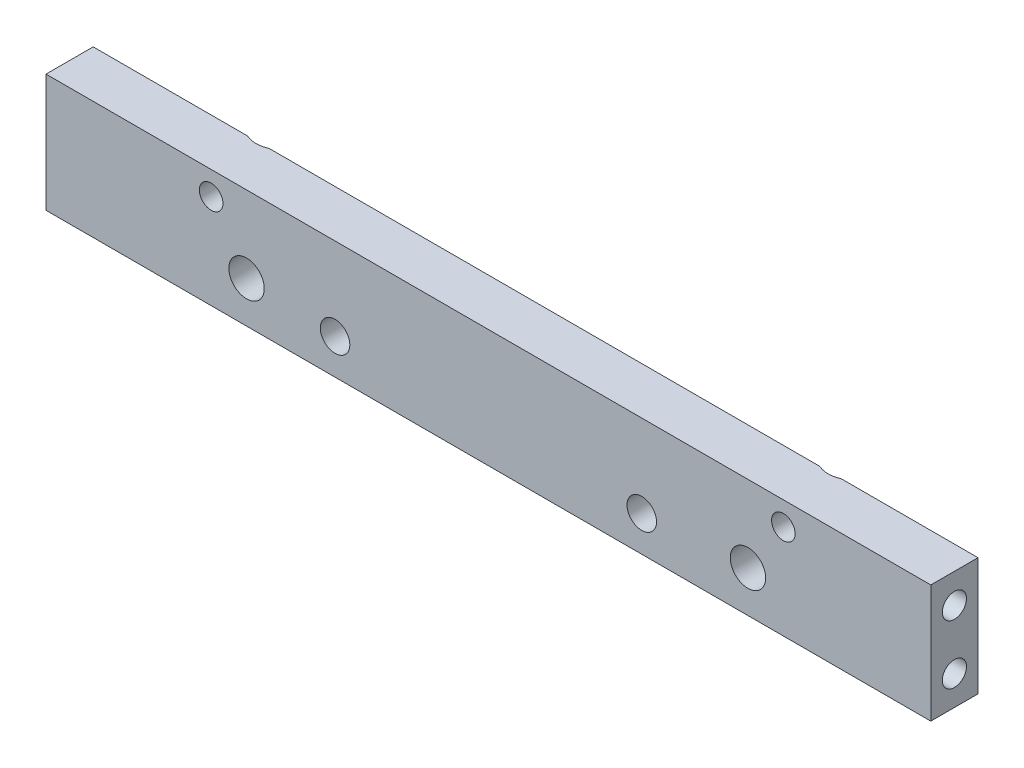
ISO-10303-21;
HEADER;
FILE_DESCRIPTION(('STEP AP214'),'2;1');
FILE_NAME('part.step','',(''),(''),'','','');
FILE_SCHEMA(('AUTOMOTIVE_DESIGN { 1 0 10303 214 1 1 1 1 }'));
ENDSEC;
DATA;
#1=APPLICATION_CONTEXT('core data for automotive mechanical design processes');
#2=APPLICATION_PROTOCOL_DEFINITION('international standard','automotive_design',2000,#1);
#3=PRODUCT_CONTEXT('',#1,'mechanical');
#4=PRODUCT('Part','Part','',(#3));
#5=PRODUCT_RELATED_PRODUCT_CATEGORY('part','',(#4));
#6=PRODUCT_DEFINITION_FORMATION('','',#4);
#7=PRODUCT_DEFINITION_CONTEXT('part definition',#1,'design');
#8=PRODUCT_DEFINITION('design','',#6,#7);
#9=PRODUCT_DEFINITION_SHAPE('','',#8);
#10=(LENGTH_UNIT() NAMED_UNIT(*) SI_UNIT(.MILLI.,.METRE.));
#11=(NAMED_UNIT(*) PLANE_ANGLE_UNIT() SI_UNIT($,.RADIAN.));
#12=(NAMED_UNIT(*) SI_UNIT($,.STERADIAN.) SOLID_ANGLE_UNIT());
#13=UNCERTAINTY_MEASURE_WITH_UNIT(LENGTH_MEASURE(1.E-05),#10,'distance_accuracy_value','');
#14=(GEOMETRIC_REPRESENTATION_CONTEXT(3) GLOBAL_UNCERTAINTY_ASSIGNED_CONTEXT((#13)) GLOBAL_UNIT_ASSIGNED_CONTEXT((#10,
#11,#12)) REPRESENTATION_CONTEXT('',''));
#15=CARTESIAN_POINT('',(0.,0.,0.));
#16=DIRECTION('',(0.,0.,1.));
#17=DIRECTION('',(1.,0.,0.));
#18=AXIS2_PLACEMENT_3D('',#15,#16,#17);
#19=CARTESIAN_POINT('',(0.,0.,0.));
#20=DIRECTION('',(0.,0.,1.));
#21=DIRECTION('',(1.,0.,0.));
#22=AXIS2_PLACEMENT_3D('',#19,#20,#21);
#23=PLANE('',#22);
#24=CARTESIAN_POINT('',(-13.,-2.,0.));
#25=DIRECTION('',(0.,0.,-1.));
#26=DIRECTION('',(-1.,0.,0.));
#27=AXIS2_PLACEMENT_3D('',#24,#25,#26);
#28=CIRCLE('',#27,1.24999999999999);
#29=CARTESIAN_POINT('',(-14.25,-2.,0.));
#30=VERTEX_POINT('',#29);
#31=EDGE_CURVE('E175',#30,#30,#28,.T.);
#32=ORIENTED_EDGE('',*,*,#31,.F.);
#33=EDGE_LOOP('',(#32));
#34=FACE_BOUND('',#33,.T.);
#35=CARTESIAN_POINT('',(13.,-2.,0.));
#36=DIRECTION('',(0.,0.,-1.));
#37=DIRECTION('',(-1.,0.,0.));
#38=AXIS2_PLACEMENT_3D('',#35,#36,#37);
#39=CIRCLE('',#38,1.24999999999999);
#40=CARTESIAN_POINT('',(11.75,-2.,0.));
#41=VERTEX_POINT('',#40);
#42=EDGE_CURVE('E169',#41,#41,#39,.T.);
#43=ORIENTED_EDGE('',*,*,#42,.F.);
#44=EDGE_LOOP('',(#43));
#45=FACE_BOUND('',#44,.T.);
#46=CARTESIAN_POINT('',(-20.5,-1.5,0.));
#47=DIRECTION('',(0.,0.,-1.));
#48=DIRECTION('',(-1.,0.,0.));
#49=AXIS2_PLACEMENT_3D('',#46,#47,#48);
#50=CIRCLE('',#49,2.8);
#51=CARTESIAN_POINT('',(-23.3,-1.5,0.));
#52=VERTEX_POINT('',#51);
#53=EDGE_CURVE('E160',#52,#52,#50,.T.);
#54=ORIENTED_EDGE('',*,*,#53,.F.);
#55=EDGE_LOOP('',(#54));
#56=FACE_BOUND('',#55,.T.);
#57=CARTESIAN_POINT('',(22.,-1.5,0.));
#58=DIRECTION('',(0.,0.,-1.));
#59=DIRECTION('',(-1.,0.,0.));
#60=AXIS2_PLACEMENT_3D('',#57,#58,#59);
#61=CIRCLE('',#60,2.8);
#62=CARTESIAN_POINT('',(19.2,-1.5,0.));
#63=VERTEX_POINT('',#62);
#64=EDGE_CURVE('E151',#63,#63,#61,.T.);
#65=ORIENTED_EDGE('',*,*,#64,.F.);
#66=EDGE_LOOP('',(#65));
#67=FACE_BOUND('',#66,.T.);
#68=CARTESIAN_POINT('',(-23.5,3.,0.));
#69=DIRECTION('',(0.,0.,-1.));
#70=DIRECTION('',(-1.,0.,0.));
#71=AXIS2_PLACEMENT_3D('',#68,#69,#70);
#72=CIRCLE('',#71,2.2);
#73=CARTESIAN_POINT('',(-22.5834848610088,5.,0.));
#74=VERTEX_POINT('',#73);
#75=CARTESIAN_POINT('',(-24.4165151389912,5.,0.));
#76=VERTEX_POINT('',#75);
#77=EDGE_CURVE('E55',#74,#76,#72,.T.);
#78=ORIENTED_EDGE('',*,*,#77,.F.);
#79=DIRECTION('',(-1.,0.,0.));
#80=VECTOR('',#79,1.);
#81=CARTESIAN_POINT('',(37.5,5.,0.));
#82=LINE('',#81,#80);
#83=CARTESIAN_POINT('',(24.0834848610088,5.,0.));
#84=VERTEX_POINT('',#83);
#85=EDGE_CURVE('E194',#84,#74,#82,.T.);
#86=ORIENTED_EDGE('',*,*,#85,.F.);
#87=CARTESIAN_POINT('',(25.,3.,0.));
#88=DIRECTION('',(0.,0.,-1.));
#89=DIRECTION('',(-1.,0.,0.));
#90=AXIS2_PLACEMENT_3D('',#87,#88,#89);
#91=CIRCLE('',#90,2.2);
#92=CARTESIAN_POINT('',(25.9165151389912,5.,0.));
#93=VERTEX_POINT('',#92);
#94=EDGE_CURVE('E62',#93,#84,#91,.T.);
#95=ORIENTED_EDGE('',*,*,#94,.F.);
#96=CARTESIAN_POINT('',(37.5,5.,0.));
#97=VERTEX_POINT('',#96);
#98=EDGE_CURVE('E190',#97,#93,#82,.T.);
#99=ORIENTED_EDGE('',*,*,#98,.F.);
#100=DIRECTION('',(0.,1.,0.));
#101=VECTOR('',#100,1.);
#102=CARTESIAN_POINT('',(37.5,-5.,0.));
#103=LINE('',#102,#101);
#104=CARTESIAN_POINT('',(37.5,-5.,0.));
#105=VERTEX_POINT('',#104);
#106=EDGE_CURVE('E185',#105,#97,#103,.T.);
#107=ORIENTED_EDGE('',*,*,#106,.F.);
#108=DIRECTION('',(1.,0.,0.));
#109=VECTOR('',#108,1.);
#110=CARTESIAN_POINT('',(-37.5,-5.,0.));
#111=LINE('',#110,#109);
#112=CARTESIAN_POINT('',(-37.5,-5.,0.));
#113=VERTEX_POINT('',#112);
#114=EDGE_CURVE('E182',#113,#105,#111,.T.);
#115=ORIENTED_EDGE('',*,*,#114,.F.);
#116=DIRECTION('',(0.,-1.,0.));
#117=VECTOR('',#116,1.);
#118=CARTESIAN_POINT('',(-37.5,5.,0.));
#119=LINE('',#118,#117);
#120=CARTESIAN_POINT('',(-37.5,5.,0.));
#121=VERTEX_POINT('',#120);
#122=EDGE_CURVE('E193',#121,#113,#119,.T.);
#123=ORIENTED_EDGE('',*,*,#122,.F.);
#124=EDGE_CURVE('E189',#76,#121,#82,.T.);
#125=ORIENTED_EDGE('',*,*,#124,.F.);
#126=EDGE_LOOP('',(#78,#86,#95,#99,#107,#115,#123,#125));
#127=FACE_BOUND('',#126,.T.);
#128=ADVANCED_FACE('F37',(#34,#45,#56,#67,#127),#23,.F.);
#129=CARTESIAN_POINT('',(-37.5,-5.,0.));
#130=DIRECTION('',(0.,-1.,0.));
#131=DIRECTION('',(0.,0.,-1.));
#132=AXIS2_PLACEMENT_3D('',#129,#130,#131);
#133=PLANE('',#132);
#134=DIRECTION('',(1.,0.,0.));
#135=VECTOR('',#134,1.);
#136=CARTESIAN_POINT('',(-37.5,-5.,4.));
#137=LINE('',#136,#135);
#138=CARTESIAN_POINT('',(-37.5,-5.,4.));
#139=VERTEX_POINT('',#138);
#140=CARTESIAN_POINT('',(37.5,-5.,4.));
#141=VERTEX_POINT('',#140);
#142=EDGE_CURVE('E181',#139,#141,#137,.T.);
#143=ORIENTED_EDGE('',*,*,#142,.F.);
#144=DIRECTION('',(0.,0.,1.));
#145=VECTOR('',#144,1.);
#146=CARTESIAN_POINT('',(-37.5,-5.,0.));
#147=LINE('',#146,#145);
#148=EDGE_CURVE('E208',#113,#139,#147,.T.);
#149=ORIENTED_EDGE('',*,*,#148,.F.);
#150=ORIENTED_EDGE('',*,*,#114,.T.);
#151=DIRECTION('',(0.,0.,1.));
#152=VECTOR('',#151,1.);
#153=CARTESIAN_POINT('',(37.5,-5.,0.));
#154=LINE('',#153,#152);
#155=EDGE_CURVE('E197',#105,#141,#154,.T.);
#156=ORIENTED_EDGE('',*,*,#155,.T.);
#157=EDGE_LOOP('',(#143,#149,#150,#156));
#158=FACE_BOUND('',#157,.T.);
#159=ADVANCED_FACE('F39',(#158),#133,.T.);
#160=CARTESIAN_POINT('',(-37.5,5.,0.));
#161=DIRECTION('',(-1.,0.,0.));
#162=DIRECTION('',(0.,0.,1.));
#163=AXIS2_PLACEMENT_3D('',#160,#161,#162);
#164=PLANE('',#163);
#165=CARTESIAN_POINT('',(-37.5,-2.49999999999999,2.));
#166=DIRECTION('',(-1.,0.,0.));
#167=DIRECTION('',(0.,0.,1.));
#168=AXIS2_PLACEMENT_3D('',#165,#166,#167);
#169=CIRCLE('',#168,1.02499999999999);
#170=CARTESIAN_POINT('',(-37.5,-2.49999999999999,3.02499999999999));
#171=VERTEX_POINT('',#170);
#172=EDGE_CURVE('E115',#171,#171,#169,.T.);
#173=ORIENTED_EDGE('',*,*,#172,.F.);
#174=EDGE_LOOP('',(#173));
#175=FACE_BOUND('',#174,.T.);
#176=CARTESIAN_POINT('',(-37.5,2.50000000000001,2.));
#177=DIRECTION('',(-1.,0.,0.));
#178=DIRECTION('',(0.,0.,1.));
#179=AXIS2_PLACEMENT_3D('',#176,#177,#178);
#180=CIRCLE('',#179,1.02499999999999);
#181=CARTESIAN_POINT('',(-37.5,2.50000000000001,3.02499999999999));
#182=VERTEX_POINT('',#181);
#183=EDGE_CURVE('E114',#182,#182,#180,.T.);
#184=ORIENTED_EDGE('',*,*,#183,.F.);
#185=EDGE_LOOP('',(#184));
#186=FACE_BOUND('',#185,.T.);
#187=DIRECTION('',(0.,-1.,0.));
#188=VECTOR('',#187,1.);
#189=CARTESIAN_POINT('',(-37.5,5.,4.));
#190=LINE('',#189,#188);
#191=CARTESIAN_POINT('',(-37.5,5.,4.));
#192=VERTEX_POINT('',#191);
#193=EDGE_CURVE('E186',#192,#139,#190,.T.);
#194=ORIENTED_EDGE('',*,*,#193,.F.);
#195=DIRECTION('',(0.,0.,1.));
#196=VECTOR('',#195,1.);
#197=CARTESIAN_POINT('',(-37.5,5.,0.));
#198=LINE('',#197,#196);
#199=EDGE_CURVE('E210',#121,#192,#198,.T.);
#200=ORIENTED_EDGE('',*,*,#199,.F.);
#201=ORIENTED_EDGE('',*,*,#122,.T.);
#202=ORIENTED_EDGE('',*,*,#148,.T.);
#203=EDGE_LOOP('',(#194,#200,#201,#202));
#204=FACE_BOUND('',#203,.T.);
#205=ADVANCED_FACE('F262',(#175,#186,#204),#164,.T.);
#206=CARTESIAN_POINT('',(37.5,5.,0.));
#207=DIRECTION('',(0.,1.,0.));
#208=DIRECTION('',(0.,0.,1.));
#209=AXIS2_PLACEMENT_3D('',#206,#207,#208);
#210=PLANE('',#209);
#211=CARTESIAN_POINT('',(-30.9537444670653,5.,-5.51740283905835));
#212=CARTESIAN_POINT('',(-30.7609572313868,5.,-5.3312191195165));
#213=CARTESIAN_POINT('',(-30.5679432853368,5.,-5.14526899159739));
#214=CARTESIAN_POINT('',(-30.1812881003326,5.,-4.77399648128244));
#215=CARTESIAN_POINT('',(-29.987646820528,5.,-4.58867414144191));
#216=CARTESIAN_POINT('',(-29.5989886357544,5.,-4.21827070382132));
#217=CARTESIAN_POINT('',(-29.4039693285491,5.,-4.03319212453696));
#218=CARTESIAN_POINT('',(-29.0129144908888,5.,-3.66413138712149));
#219=CARTESIAN_POINT('',(-28.8168790152372,5.,-3.48014917098907));
#220=CARTESIAN_POINT('',(-28.3989389471719,5.,-3.09085140106527));
#221=CARTESIAN_POINT('',(-28.176852015544,5.,-2.88573136843218));
#222=CARTESIAN_POINT('',(-27.730125890131,5.,-2.47819485909058));
#223=CARTESIAN_POINT('',(-27.505486252446,5.,-2.27577886633589));
#224=CARTESIAN_POINT('',(-27.165836202451,5.,-1.97559569445815));
#225=CARTESIAN_POINT('',(-27.0522718458193,5.,-1.8761937678703));
#226=CARTESIAN_POINT('',(-26.8239205919216,5.,-1.67880607129598));
#227=CARTESIAN_POINT('',(-26.7091337236699,5.,-1.58082026782971));
#228=CARTESIAN_POINT('',(-26.4780259321376,5.,-1.38674002075604));
#229=CARTESIAN_POINT('',(-26.3617054666104,5.,-1.29064503320099));
#230=CARTESIAN_POINT('',(-26.1270276516212,5.,-1.10098152041193));
#231=CARTESIAN_POINT('',(-26.0086705003833,5.,-1.00741275156089));
#232=CARTESIAN_POINT('',(-25.824600113662,5.,-0.866279854787983));
#233=CARTESIAN_POINT('',(-25.7598555206962,5.,-0.817452896528104));
#234=CARTESIAN_POINT('',(-25.6294332439196,5.,-0.721053300964097));
#235=CARTESIAN_POINT('',(-25.5637555299504,5.,-0.673480704343515));
#236=CARTESIAN_POINT('',(-25.4312074381853,5.,-0.579812947307663));
#237=CARTESIAN_POINT('',(-25.3643354571769,5.,-0.533720048459332));
#238=CARTESIAN_POINT('',(-25.2292951181862,5.,-0.443470734076494));
#239=CARTESIAN_POINT('',(-25.161126807548,5.,-0.399314248014683));
#240=CARTESIAN_POINT('',(-25.0244107426809,5.,-0.314162915224449));
#241=CARTESIAN_POINT('',(-24.9558883389048,5.,-0.273127582470677));
#242=CARTESIAN_POINT('',(-24.8171031356815,5.,-0.194056584704623));
#243=CARTESIAN_POINT('',(-24.7468399955787,5.,-0.156021513023615));
#244=CARTESIAN_POINT('',(-24.6045139565792,5.,-0.0838993254892132));
#245=CARTESIAN_POINT('',(-24.5324558711233,5.,-0.0498027965536664));
#246=CARTESIAN_POINT('',(-24.386207818762,5.,0.013445016762987));
#247=CARTESIAN_POINT('',(-24.3120188857261,5.,0.0425986535332799));
#248=CARTESIAN_POINT('',(-24.1750270547537,5.,0.0899498758784931));
#249=CARTESIAN_POINT('',(-24.1125821686639,5.,0.109175084503761));
#250=CARTESIAN_POINT('',(-23.9863465611848,5.,0.142615138778067));
#251=CARTESIAN_POINT('',(-23.9225558940554,5.,0.156830186021742));
#252=CARTESIAN_POINT('',(-23.7943130273172,5.,0.179439892598953));
#253=CARTESIAN_POINT('',(-23.7298667390288,5.,0.187867542810822));
#254=CARTESIAN_POINT('',(-23.6004590917354,5.,0.198516238143231));
#255=CARTESIAN_POINT('',(-23.5354977813399,5.,0.200737862178622));
#256=CARTESIAN_POINT('',(-23.4073758220636,5.,0.198854581581166));
#257=CARTESIAN_POINT('',(-23.34421265356,5.,0.194914160911863));
#258=CARTESIAN_POINT('',(-23.2185208865906,5.,0.181256573755658));
#259=CARTESIAN_POINT('',(-23.1559923280262,5.,0.17153904629103));
#260=CARTESIAN_POINT('',(-23.0316361705671,5.,0.14680108503503));
#261=CARTESIAN_POINT('',(-22.9698146377757,5.,0.131750597059768));
#262=CARTESIAN_POINT('',(-22.8474871560365,5.,0.0970655127025517));
#263=CARTESIAN_POINT('',(-22.786981310419,5.,0.077430557680843));
#264=CARTESIAN_POINT('',(-22.591954389968,5.,0.00714870067114519));
#265=CARTESIAN_POINT('',(-22.4602823459129,5.,-0.0513892312157715));
#266=CARTESIAN_POINT('',(-22.203236620767,5.,-0.181012244201666));
#267=CARTESIAN_POINT('',(-22.0778766589934,5.,-0.252123258259688));
#268=CARTESIAN_POINT('',(-21.8927643595024,5.,-0.365310517226115));
#269=CARTESIAN_POINT('',(-21.8311547332631,5.,-0.404404229306037));
#270=CARTESIAN_POINT('',(-21.709041006591,5.,-0.484286111176788));
#271=CARTESIAN_POINT('',(-21.6485369356419,5.,-0.52507432606319));
#272=CARTESIAN_POINT('',(-21.5285451455704,5.,-0.607981014966571));
#273=CARTESIAN_POINT('',(-21.4690564256923,5.,-0.650098046777443));
#274=CARTESIAN_POINT('',(-21.3509029214881,5.,-0.735465007638222));
#275=CARTESIAN_POINT('',(-21.2922381055337,5.,-0.77871489301619));
#276=CARTESIAN_POINT('',(-21.0971423456846,5.,-0.924977814251651));
#277=CARTESIAN_POINT('',(-20.9622909386431,5.,-1.03009762534798));
#278=CARTESIAN_POINT('',(-20.6953472519892,5.,-1.24379402074465));
#279=CARTESIAN_POINT('',(-20.5632554263149,5.,-1.35237116646));
#280=CARTESIAN_POINT('',(-20.3010592790722,5.,-1.57201509024586));
#281=CARTESIAN_POINT('',(-20.1709559041757,5.,-1.68308299563529));
#282=CARTESIAN_POINT('',(-19.9122910004332,5.,-1.90700294770604));
#283=CARTESIAN_POINT('',(-19.7837295232662,5.,-2.01985505389516));
#284=CARTESIAN_POINT('',(-19.5275163893519,5.,-2.24714785401915));
#285=CARTESIAN_POINT('',(-19.3998673453305,5.,-2.36159148840349));
#286=CARTESIAN_POINT('',(-19.1455085062288,5.,-2.59151866231546));
#287=CARTESIAN_POINT('',(-19.0187987200768,5.,-2.70700221170512));
#288=CARTESIAN_POINT('',(-18.639857085462,5.,-3.05459748295606));
#289=CARTESIAN_POINT('',(-18.3887375357254,5.,-3.28792125633021));
#290=CARTESIAN_POINT('',(-17.9178659536981,5.,-3.72911003502842));
#291=CARTESIAN_POINT('',(-17.697896474236,5.,-3.93674382646793));
#292=CARTESIAN_POINT('',(-17.2590590157813,5.,-4.35320972210792));
#293=CARTESIAN_POINT('',(-17.0401911336514,5.,-4.56204192834462));
#294=CARTESIAN_POINT('',(-16.6041483085531,5.,-4.97975382903268));
#295=CARTESIAN_POINT('',(-16.3869700927344,5.,-5.18863011097075));
#296=CARTESIAN_POINT('',(-15.9532828295449,5.,-5.60703322954203));
#297=CARTESIAN_POINT('',(-15.7367737176382,5.,-5.8165599992624));
#298=CARTESIAN_POINT('',(-15.5204982143424,5.,-6.02632656459202));
#299=B_SPLINE_CURVE_WITH_KNOTS('',3,(#211,#212,#213,#214,#215,#216,#217,#218,#219,#220,#221,
#222,#223,#224,#225,#226,#227,#228,#229,#230,#231,#232,#233,#234,#235,#236,#237,#238,#239,#240,
#241,#242,#243,#244,#245,#246,#247,#248,#249,#250,#251,#252,#253,#254,#255,#256,#257,#258,#259,
#260,#261,#262,#263,#264,#265,#266,#267,#268,#269,#270,#271,#272,#273,#274,#275,#276,#277,#278,
#279,#280,#281,#282,#283,#284,#285,#286,#287,#288,#289,#290,#291,#292,#293,#294,#295,#296,#297,
#298),.UNSPECIFIED.,.F.,.F.,(4,2,2,2,2,2,2,2,2,2,2,2,2,2,2,2,2,2,2,2,2,2,2,2,2,2,2,2,2,2,2,2,2,
2,2,2,2,2,2,2,2,2,2,4),(0.,0.80404185093481,1.60813715575374,2.41471919137387,3.22125817037103,
4.12820305884212,5.03530814927368,5.48806734819472,5.94081582546995,6.39343209395969,
6.84600455715205,7.08926927012609,7.33254186338513,7.57617010182923,7.81978945955443,
8.05934016445651,8.29893812472469,8.53795105103263,8.77684990660647,8.97268815181434,
9.16851851614868,9.36322307630469,9.55790947328785,9.74748712606468,9.93707662568909,
10.1277520197751,10.3184423352688,10.7495218197644,11.1815010380857,11.4003756375643,
11.6192560656591,11.8379065974208,12.0565487124907,12.5693978785807,13.0823307520557,
13.5955006614668,14.1086877227053,14.6229999265187,15.1373170129589,16.1656476997385,
17.0731042860013,17.9806393170951,18.8846074711161,19.7884855304568),.UNSPECIFIED.);
#300=EDGE_CURVE('E11',#76,#74,#299,.T.);
#301=ORIENTED_EDGE('',*,*,#300,.F.);
#302=ORIENTED_EDGE('',*,*,#124,.T.);
#303=ORIENTED_EDGE('',*,*,#199,.T.);
#304=DIRECTION('',(-1.,0.,0.));
#305=VECTOR('',#304,1.);
#306=CARTESIAN_POINT('',(37.5,5.,4.));
#307=LINE('',#306,#305);
#308=CARTESIAN_POINT('',(37.5,5.,4.));
#309=VERTEX_POINT('',#308);
#310=EDGE_CURVE('E203',#309,#192,#307,.T.);
#311=ORIENTED_EDGE('',*,*,#310,.F.);
#312=DIRECTION('',(0.,0.,1.));
#313=VECTOR('',#312,1.);
#314=CARTESIAN_POINT('',(37.5,5.,0.));
#315=LINE('',#314,#313);
#316=EDGE_CURVE('E212',#97,#309,#315,.T.);
#317=ORIENTED_EDGE('',*,*,#316,.F.);
#318=ORIENTED_EDGE('',*,*,#98,.T.);
#319=CARTESIAN_POINT('',(17.5462555329347,5.,-5.51740283905835));
#320=CARTESIAN_POINT('',(17.7390427686132,5.,-5.3312191195165));
#321=CARTESIAN_POINT('',(17.9320567146632,5.,-5.14526899159739));
#322=CARTESIAN_POINT('',(18.3187118996674,5.,-4.77399648128244));
#323=CARTESIAN_POINT('',(18.512353179472,5.,-4.58867414144191));
#324=CARTESIAN_POINT('',(18.9010113642456,5.,-4.21827070382132));
#325=CARTESIAN_POINT('',(19.0960306714509,5.,-4.03319212453696));
#326=CARTESIAN_POINT('',(19.4870855091112,5.,-3.66413138712148));
#327=CARTESIAN_POINT('',(19.6831209847628,5.,-3.48014917098907));
#328=CARTESIAN_POINT('',(20.1010610528281,5.,-3.09085140106527));
#329=CARTESIAN_POINT('',(20.323147984456,5.,-2.88573136843218));
#330=CARTESIAN_POINT('',(20.769874109869,5.,-2.47819485909058));
#331=CARTESIAN_POINT('',(20.994513747554,5.,-2.27577886633589));
#332=CARTESIAN_POINT('',(21.334163797549,5.,-1.97559569445815));
#333=CARTESIAN_POINT('',(21.4477281541807,5.,-1.8761937678703));
#334=CARTESIAN_POINT('',(21.6760794080784,5.,-1.67880607129598));
#335=CARTESIAN_POINT('',(21.7908662763301,5.,-1.58082026782971));
#336=CARTESIAN_POINT('',(22.0219740678624,5.,-1.38674002075604));
#337=CARTESIAN_POINT('',(22.1382945333896,5.,-1.29064503320099));
#338=CARTESIAN_POINT('',(22.3729723483788,5.,-1.10098152041193));
#339=CARTESIAN_POINT('',(22.4913294996167,5.,-1.00741275156089));
#340=CARTESIAN_POINT('',(22.675399886338,5.,-0.866279854787984));
#341=CARTESIAN_POINT('',(22.7401444793038,5.,-0.817452896528105));
#342=CARTESIAN_POINT('',(22.8705667560804,5.,-0.721053300964098));
#343=CARTESIAN_POINT('',(22.9362444700496,5.,-0.673480704343515));
#344=CARTESIAN_POINT('',(23.0687925618147,5.,-0.579812947307663));
#345=CARTESIAN_POINT('',(23.1356645428231,5.,-0.533720048459332));
#346=CARTESIAN_POINT('',(23.2707048818138,5.,-0.443470734076494));
#347=CARTESIAN_POINT('',(23.338873192452,5.,-0.399314248014683));
#348=CARTESIAN_POINT('',(23.4755892573191,5.,-0.31416291522445));
#349=CARTESIAN_POINT('',(23.5441116610952,5.,-0.273127582470679));
#350=CARTESIAN_POINT('',(23.6828968643185,5.,-0.194056584704625));
#351=CARTESIAN_POINT('',(23.7531600044213,5.,-0.156021513023616));
#352=CARTESIAN_POINT('',(23.8954860434208,5.,-0.0838993254892137));
#353=CARTESIAN_POINT('',(23.9675441288767,5.,-0.0498027965536675));
#354=CARTESIAN_POINT('',(24.113792181238,5.,0.013445016762986));
#355=CARTESIAN_POINT('',(24.1879811142739,5.,0.0425986535332796));
#356=CARTESIAN_POINT('',(24.3249729452463,5.,0.0899498758784933));
#357=CARTESIAN_POINT('',(24.3874178313361,5.,0.109175084503761));
#358=CARTESIAN_POINT('',(24.5136534388152,5.,0.142615138778067));
#359=CARTESIAN_POINT('',(24.5774441059446,5.,0.156830186021742));
#360=CARTESIAN_POINT('',(24.7056869726828,5.,0.179439892598953));
#361=CARTESIAN_POINT('',(24.7701332609712,5.,0.187867542810822));
#362=CARTESIAN_POINT('',(24.8995409082646,5.,0.198516238143231));
#363=CARTESIAN_POINT('',(24.9645022186601,5.,0.200737862178622));
#364=CARTESIAN_POINT('',(25.0926241779364,5.,0.198854581581166));
#365=CARTESIAN_POINT('',(25.15578734644,5.,0.194914160911863));
#366=CARTESIAN_POINT('',(25.2814791134094,5.,0.181256573755659));
#367=CARTESIAN_POINT('',(25.3440076719738,5.,0.171539046291031));
#368=CARTESIAN_POINT('',(25.4683638294329,5.,0.146801085035031));
#369=CARTESIAN_POINT('',(25.5301853622243,5.,0.13175059705977));
#370=CARTESIAN_POINT('',(25.6525128439635,5.,0.0970655127025535));
#371=CARTESIAN_POINT('',(25.713018689581,5.,0.0774305576808438));
#372=CARTESIAN_POINT('',(25.908045610032,5.,0.00714870067114438));
#373=CARTESIAN_POINT('',(26.0397176540871,5.,-0.0513892312157718));
#374=CARTESIAN_POINT('',(26.296763379233,5.,-0.181012244201666));
#375=CARTESIAN_POINT('',(26.4221233410067,5.,-0.252123258259688));
#376=CARTESIAN_POINT('',(26.6072356404976,5.,-0.365310517226115));
#377=CARTESIAN_POINT('',(26.6688452667369,5.,-0.404404229306037));
#378=CARTESIAN_POINT('',(26.790958993409,5.,-0.484286111176788));
#379=CARTESIAN_POINT('',(26.8514630643581,5.,-0.52507432606319));
#380=CARTESIAN_POINT('',(26.9714548544296,5.,-0.607981014966571));
#381=CARTESIAN_POINT('',(27.0309435743077,5.,-0.650098046777445));
#382=CARTESIAN_POINT('',(27.1490970785119,5.,-0.735465007638223));
#383=CARTESIAN_POINT('',(27.2077618944663,5.,-0.77871489301619));
#384=CARTESIAN_POINT('',(27.4028576543154,5.,-0.924977814251651));
#385=CARTESIAN_POINT('',(27.5377090613569,5.,-1.03009762534798));
#386=CARTESIAN_POINT('',(27.8046527480108,5.,-1.24379402074465));
#387=CARTESIAN_POINT('',(27.9367445736852,5.,-1.35237116646));
#388=CARTESIAN_POINT('',(28.1989407209278,5.,-1.57201509024586));
#389=CARTESIAN_POINT('',(28.3290440958243,5.,-1.68308299563529));
#390=CARTESIAN_POINT('',(28.5877089995668,5.,-1.90700294770604));
#391=CARTESIAN_POINT('',(28.7162704767338,5.,-2.01985505389516));
#392=CARTESIAN_POINT('',(28.9724836106481,5.,-2.24714785401915));
#393=CARTESIAN_POINT('',(29.1001326546695,5.,-2.36159148840349));
#394=CARTESIAN_POINT('',(29.3544914937712,5.,-2.59151866231546));
#395=CARTESIAN_POINT('',(29.4812012799232,5.,-2.70700221170512));
#396=CARTESIAN_POINT('',(29.860142914538,5.,-3.05459748295606));
#397=CARTESIAN_POINT('',(30.1112624642746,5.,-3.28792125633021));
#398=CARTESIAN_POINT('',(30.5821340463019,5.,-3.72911003502841));
#399=CARTESIAN_POINT('',(30.802103525764,5.,-3.93674382646792));
#400=CARTESIAN_POINT('',(31.2409409842187,5.,-4.35320972210791));
#401=CARTESIAN_POINT('',(31.4598088663486,5.,-4.56204192834462));
#402=CARTESIAN_POINT('',(31.8958516914469,5.,-4.97975382903268));
#403=CARTESIAN_POINT('',(32.1130299072656,5.,-5.18863011097074));
#404=CARTESIAN_POINT('',(32.5467171704551,5.,-5.60703322954203));
#405=CARTESIAN_POINT('',(32.7632262823618,5.,-5.81655999926239));
#406=CARTESIAN_POINT('',(32.9795017856576,5.,-6.02632656459202));
#407=B_SPLINE_CURVE_WITH_KNOTS('',3,(#319,#320,#321,#322,#323,#324,#325,#326,#327,#328,#329,
#330,#331,#332,#333,#334,#335,#336,#337,#338,#339,#340,#341,#342,#343,#344,#345,#346,#347,#348,
#349,#350,#351,#352,#353,#354,#355,#356,#357,#358,#359,#360,#361,#362,#363,#364,#365,#366,#367,
#368,#369,#370,#371,#372,#373,#374,#375,#376,#377,#378,#379,#380,#381,#382,#383,#384,#385,#386,
#387,#388,#389,#390,#391,#392,#393,#394,#395,#396,#397,#398,#399,#400,#401,#402,#403,#404,#405,
#406),.UNSPECIFIED.,.F.,.F.,(4,2,2,2,2,2,2,2,2,2,2,2,2,2,2,2,2,2,2,2,2,2,2,2,2,2,2,2,2,2,2,2,2,
2,2,2,2,2,2,2,2,2,2,4),(0.,0.80404185093481,1.60813715575374,2.41471919137387,3.22125817037103,
4.12820305884212,5.03530814927368,5.48806734819472,5.94081582546995,6.39343209395969,
6.84600455715205,7.08926927012608,7.33254186338513,7.57617010182923,7.81978945955443,
8.0593401644565,8.29893812472469,8.53795105103263,8.77684990660648,8.97268815181434,
9.16851851614868,9.36322307630469,9.55790947328785,9.74748712606467,9.93707662568909,
10.1277520197751,10.3184423352688,10.7495218197644,11.1815010380857,11.4003756375643,
11.6192560656591,11.8379065974208,12.0565487124907,12.5693978785807,13.0823307520557,
13.5955006614668,14.1086877227053,14.6229999265187,15.1373170129589,16.1656476997385,
17.0731042860013,17.9806393170951,18.8846074711161,19.7884855304568),.UNSPECIFIED.);
#408=EDGE_CURVE('E50',#84,#93,#407,.T.);
#409=ORIENTED_EDGE('',*,*,#408,.F.);
#410=ORIENTED_EDGE('',*,*,#85,.T.);
#411=EDGE_LOOP('',(#301,#302,#303,#311,#317,#318,#409,#410));
#412=FACE_BOUND('',#411,.T.);
#413=ADVANCED_FACE('F218',(#412),#210,.T.);
#414=CARTESIAN_POINT('',(37.5,-5.,0.));
#415=DIRECTION('',(1.,0.,0.));
#416=DIRECTION('',(0.,0.,-1.));
#417=AXIS2_PLACEMENT_3D('',#414,#415,#416);
#418=PLANE('',#417);
#419=CARTESIAN_POINT('',(37.5,2.50000000000001,2.));
#420=DIRECTION('',(1.,0.,0.));
#421=DIRECTION('',(0.,0.,-1.));
#422=AXIS2_PLACEMENT_3D('',#419,#420,#421);
#423=CIRCLE('',#422,1.025);
#424=CARTESIAN_POINT('',(37.5,2.50000000000001,0.975000000000001));
#425=VERTEX_POINT('',#424);
#426=EDGE_CURVE('E125',#425,#425,#423,.T.);
#427=ORIENTED_EDGE('',*,*,#426,.F.);
#428=EDGE_LOOP('',(#427));
#429=FACE_BOUND('',#428,.T.);
#430=CARTESIAN_POINT('',(37.5,-2.49999999999999,2.));
#431=DIRECTION('',(1.,0.,0.));
#432=DIRECTION('',(0.,0.,-1.));
#433=AXIS2_PLACEMENT_3D('',#430,#431,#432);
#434=CIRCLE('',#433,1.025);
#435=CARTESIAN_POINT('',(37.5,-2.49999999999999,0.975000000000001));
#436=VERTEX_POINT('',#435);
#437=EDGE_CURVE('E131',#436,#436,#434,.T.);
#438=ORIENTED_EDGE('',*,*,#437,.F.);
#439=EDGE_LOOP('',(#438));
#440=FACE_BOUND('',#439,.T.);
#441=DIRECTION('',(0.,1.,0.));
#442=VECTOR('',#441,1.);
#443=CARTESIAN_POINT('',(37.5,-5.,4.));
#444=LINE('',#443,#442);
#445=EDGE_CURVE('E200',#141,#309,#444,.T.);
#446=ORIENTED_EDGE('',*,*,#445,.F.);
#447=ORIENTED_EDGE('',*,*,#155,.F.);
#448=ORIENTED_EDGE('',*,*,#106,.T.);
#449=ORIENTED_EDGE('',*,*,#316,.T.);
#450=EDGE_LOOP('',(#446,#447,#448,#449));
#451=FACE_BOUND('',#450,.T.);
#452=ADVANCED_FACE('F260',(#429,#440,#451),#418,.T.);
#453=CARTESIAN_POINT('',(0.,0.,4.));
#454=DIRECTION('',(0.,0.,1.));
#455=DIRECTION('',(1.,0.,0.));
#456=AXIS2_PLACEMENT_3D('',#453,#454,#455);
#457=PLANE('',#456);
#458=CARTESIAN_POINT('',(-23.5,3.,4.));
#459=DIRECTION('',(0.,0.,-1.));
#460=DIRECTION('',(-1.,0.,0.));
#461=AXIS2_PLACEMENT_3D('',#458,#459,#460);
#462=CIRCLE('',#461,1.);
#463=CARTESIAN_POINT('',(-24.5,3.,4.));
#464=VERTEX_POINT('',#463);
#465=EDGE_CURVE('E141',#464,#464,#462,.T.);
#466=ORIENTED_EDGE('',*,*,#465,.T.);
#467=EDGE_LOOP('',(#466));
#468=FACE_BOUND('',#467,.T.);
#469=CARTESIAN_POINT('',(25.,3.,4.));
#470=DIRECTION('',(0.,0.,-1.));
#471=DIRECTION('',(-1.,0.,0.));
#472=AXIS2_PLACEMENT_3D('',#469,#470,#471);
#473=CIRCLE('',#472,1.);
#474=CARTESIAN_POINT('',(24.,3.,4.));
#475=VERTEX_POINT('',#474);
#476=EDGE_CURVE('E148',#475,#475,#473,.T.);
#477=ORIENTED_EDGE('',*,*,#476,.T.);
#478=EDGE_LOOP('',(#477));
#479=FACE_BOUND('',#478,.T.);
#480=CARTESIAN_POINT('',(22.,-1.5,4.));
#481=DIRECTION('',(0.,0.,-1.));
#482=DIRECTION('',(-1.,0.,0.));
#483=AXIS2_PLACEMENT_3D('',#480,#481,#482);
#484=CIRCLE('',#483,1.5);
#485=CARTESIAN_POINT('',(20.5,-1.5,4.));
#486=VERTEX_POINT('',#485);
#487=EDGE_CURVE('E157',#486,#486,#484,.T.);
#488=ORIENTED_EDGE('',*,*,#487,.T.);
#489=EDGE_LOOP('',(#488));
#490=FACE_BOUND('',#489,.T.);
#491=CARTESIAN_POINT('',(-20.5,-1.5,4.));
#492=DIRECTION('',(0.,0.,-1.));
#493=DIRECTION('',(-1.,0.,0.));
#494=AXIS2_PLACEMENT_3D('',#491,#492,#493);
#495=CIRCLE('',#494,1.5);
#496=CARTESIAN_POINT('',(-22.,-1.5,4.));
#497=VERTEX_POINT('',#496);
#498=EDGE_CURVE('E166',#497,#497,#495,.T.);
#499=ORIENTED_EDGE('',*,*,#498,.T.);
#500=EDGE_LOOP('',(#499));
#501=FACE_BOUND('',#500,.T.);
#502=CARTESIAN_POINT('',(13.,-2.,4.));
#503=DIRECTION('',(0.,0.,-1.));
#504=DIRECTION('',(-1.,0.,0.));
#505=AXIS2_PLACEMENT_3D('',#502,#503,#504);
#506=CIRCLE('',#505,1.25);
#507=CARTESIAN_POINT('',(11.75,-2.,4.));
#508=VERTEX_POINT('',#507);
#509=EDGE_CURVE('E172',#508,#508,#506,.T.);
#510=ORIENTED_EDGE('',*,*,#509,.T.);
#511=EDGE_LOOP('',(#510));
#512=FACE_BOUND('',#511,.T.);
#513=CARTESIAN_POINT('',(-13.,-2.,4.));
#514=DIRECTION('',(0.,0.,-1.));
#515=DIRECTION('',(-1.,0.,0.));
#516=AXIS2_PLACEMENT_3D('',#513,#514,#515);
#517=CIRCLE('',#516,1.25);
#518=CARTESIAN_POINT('',(-14.25,-2.,4.));
#519=VERTEX_POINT('',#518);
#520=EDGE_CURVE('E178',#519,#519,#517,.T.);
#521=ORIENTED_EDGE('',*,*,#520,.T.);
#522=EDGE_LOOP('',(#521));
#523=FACE_BOUND('',#522,.T.);
#524=ORIENTED_EDGE('',*,*,#142,.T.);
#525=ORIENTED_EDGE('',*,*,#445,.T.);
#526=ORIENTED_EDGE('',*,*,#310,.T.);
#527=ORIENTED_EDGE('',*,*,#193,.T.);
#528=EDGE_LOOP('',(#524,#525,#526,#527));
#529=FACE_BOUND('',#528,.T.);
#530=ADVANCED_FACE('F254',(#468,#479,#490,#501,#512,#523,#529),#457,.T.);
#531=CARTESIAN_POINT('',(-13.,-2.,0.));
#532=DIRECTION('',(0.,0.,-1.));
#533=DIRECTION('',(-1.,0.,0.));
#534=AXIS2_PLACEMENT_3D('',#531,#532,#533);
#535=CYLINDRICAL_SURFACE('',#534,1.24999999999999);
#536=ORIENTED_EDGE('',*,*,#520,.F.);
#537=EDGE_LOOP('',(#536));
#538=FACE_BOUND('',#537,.T.);
#539=ORIENTED_EDGE('',*,*,#31,.T.);
#540=EDGE_LOOP('',(#539));
#541=FACE_BOUND('',#540,.T.);
#542=ADVANCED_FACE('F250',(#538,#541),#535,.F.);
#543=CARTESIAN_POINT('',(13.,-2.,0.));
#544=DIRECTION('',(0.,0.,-1.));
#545=DIRECTION('',(-1.,0.,0.));
#546=AXIS2_PLACEMENT_3D('',#543,#544,#545);
#547=CYLINDRICAL_SURFACE('',#546,1.24999999999999);
#548=ORIENTED_EDGE('',*,*,#509,.F.);
#549=EDGE_LOOP('',(#548));
#550=FACE_BOUND('',#549,.T.);
#551=ORIENTED_EDGE('',*,*,#42,.T.);
#552=EDGE_LOOP('',(#551));
#553=FACE_BOUND('',#552,.T.);
#554=ADVANCED_FACE('F246',(#550,#553),#547,.F.);
#555=CARTESIAN_POINT('',(-20.5,-1.5,0.));
#556=DIRECTION('',(0.,0.,-1.));
#557=DIRECTION('',(-1.,0.,0.));
#558=AXIS2_PLACEMENT_3D('',#555,#556,#557);
#559=CYLINDRICAL_SURFACE('',#558,1.5);
#560=ORIENTED_EDGE('',*,*,#498,.F.);
#561=EDGE_LOOP('',(#560));
#562=FACE_BOUND('',#561,.T.);
#563=CARTESIAN_POINT('',(-20.5,-1.5,1.3));
#564=DIRECTION('',(0.,0.,-1.));
#565=DIRECTION('',(-1.,0.,0.));
#566=AXIS2_PLACEMENT_3D('',#563,#564,#565);
#567=CIRCLE('',#566,1.5);
#568=CARTESIAN_POINT('',(-22.,-1.5,1.3));
#569=VERTEX_POINT('',#568);
#570=EDGE_CURVE('E163',#569,#569,#567,.T.);
#571=ORIENTED_EDGE('',*,*,#570,.T.);
#572=EDGE_LOOP('',(#571));
#573=FACE_BOUND('',#572,.T.);
#574=ADVANCED_FACE('F242',(#562,#573),#559,.F.);
#575=CARTESIAN_POINT('',(-20.5,-1.5,0.));
#576=DIRECTION('',(0.,0.,-1.));
#577=DIRECTION('',(-1.,0.,0.));
#578=AXIS2_PLACEMENT_3D('',#575,#576,#577);
#579=CONICAL_SURFACE('',#578,2.8,0.785398163397449);
#580=ORIENTED_EDGE('',*,*,#570,.F.);
#581=EDGE_LOOP('',(#580));
#582=FACE_BOUND('',#581,.T.);
#583=ORIENTED_EDGE('',*,*,#53,.T.);
#584=EDGE_LOOP('',(#583));
#585=FACE_BOUND('',#584,.T.);
#586=ADVANCED_FACE('F238',(#582,#585),#579,.F.);
#587=CARTESIAN_POINT('',(22.,-1.5,0.));
#588=DIRECTION('',(0.,0.,-1.));
#589=DIRECTION('',(-1.,0.,0.));
#590=AXIS2_PLACEMENT_3D('',#587,#588,#589);
#591=CYLINDRICAL_SURFACE('',#590,1.5);
#592=ORIENTED_EDGE('',*,*,#487,.F.);
#593=EDGE_LOOP('',(#592));
#594=FACE_BOUND('',#593,.T.);
#595=CARTESIAN_POINT('',(22.,-1.5,1.3));
#596=DIRECTION('',(0.,0.,-1.));
#597=DIRECTION('',(-1.,0.,0.));
#598=AXIS2_PLACEMENT_3D('',#595,#596,#597);
#599=CIRCLE('',#598,1.5);
#600=CARTESIAN_POINT('',(20.5,-1.5,1.3));
#601=VERTEX_POINT('',#600);
#602=EDGE_CURVE('E154',#601,#601,#599,.T.);
#603=ORIENTED_EDGE('',*,*,#602,.T.);
#604=EDGE_LOOP('',(#603));
#605=FACE_BOUND('',#604,.T.);
#606=ADVANCED_FACE('F234',(#594,#605),#591,.F.);
#607=CARTESIAN_POINT('',(22.,-1.5,0.));
#608=DIRECTION('',(0.,0.,-1.));
#609=DIRECTION('',(-1.,0.,0.));
#610=AXIS2_PLACEMENT_3D('',#607,#608,#609);
#611=CONICAL_SURFACE('',#610,2.8,0.785398163397448);
#612=ORIENTED_EDGE('',*,*,#602,.F.);
#613=EDGE_LOOP('',(#612));
#614=FACE_BOUND('',#613,.T.);
#615=ORIENTED_EDGE('',*,*,#64,.T.);
#616=EDGE_LOOP('',(#615));
#617=FACE_BOUND('',#616,.T.);
#618=ADVANCED_FACE('F230',(#614,#617),#611,.F.);
#619=CARTESIAN_POINT('',(25.,3.,0.));
#620=DIRECTION('',(0.,0.,-1.));
#621=DIRECTION('',(-1.,0.,0.));
#622=AXIS2_PLACEMENT_3D('',#619,#620,#621);
#623=CYLINDRICAL_SURFACE('',#622,1.);
#624=ORIENTED_EDGE('',*,*,#476,.F.);
#625=EDGE_LOOP('',(#624));
#626=FACE_BOUND('',#625,.T.);
#627=CARTESIAN_POINT('',(25.,3.,1.2));
#628=DIRECTION('',(0.,0.,-1.));
#629=DIRECTION('',(-1.,0.,0.));
#630=AXIS2_PLACEMENT_3D('',#627,#628,#629);
#631=CIRCLE('',#630,1.);
#632=CARTESIAN_POINT('',(24.,3.,1.2));
#633=VERTEX_POINT('',#632);
#634=EDGE_CURVE('E145',#633,#633,#631,.T.);
#635=ORIENTED_EDGE('',*,*,#634,.T.);
#636=EDGE_LOOP('',(#635));
#637=FACE_BOUND('',#636,.T.);
#638=ADVANCED_FACE('F227',(#626,#637),#623,.F.);
#639=CARTESIAN_POINT('',(25.,3.,0.));
#640=DIRECTION('',(0.,0.,-1.));
#641=DIRECTION('',(-1.,0.,0.));
#642=AXIS2_PLACEMENT_3D('',#639,#640,#641);
#643=CONICAL_SURFACE('',#642,2.2,0.785398163397448);
#644=ORIENTED_EDGE('',*,*,#408,.T.);
#645=ORIENTED_EDGE('',*,*,#94,.T.);
#646=EDGE_LOOP('',(#644,#645));
#647=FACE_BOUND('',#646,.T.);
#648=ORIENTED_EDGE('',*,*,#634,.F.);
#649=EDGE_LOOP('',(#648));
#650=FACE_BOUND('',#649,.T.);
#651=ADVANCED_FACE('F221',(#647,#650),#643,.F.);
#652=CARTESIAN_POINT('',(-23.5,3.,0.));
#653=DIRECTION('',(0.,0.,-1.));
#654=DIRECTION('',(-1.,0.,0.));
#655=AXIS2_PLACEMENT_3D('',#652,#653,#654);
#656=CYLINDRICAL_SURFACE('',#655,1.);
#657=ORIENTED_EDGE('',*,*,#465,.F.);
#658=EDGE_LOOP('',(#657));
#659=FACE_BOUND('',#658,.T.);
#660=CARTESIAN_POINT('',(-23.5,3.,1.2));
#661=DIRECTION('',(0.,0.,-1.));
#662=DIRECTION('',(-1.,0.,0.));
#663=AXIS2_PLACEMENT_3D('',#660,#661,#662);
#664=CIRCLE('',#663,1.);
#665=CARTESIAN_POINT('',(-24.5,3.,1.2));
#666=VERTEX_POINT('',#665);
#667=EDGE_CURVE('E138',#666,#666,#664,.T.);
#668=ORIENTED_EDGE('',*,*,#667,.T.);
#669=EDGE_LOOP('',(#668));
#670=FACE_BOUND('',#669,.T.);
#671=ADVANCED_FACE('F226',(#659,#670),#656,.F.);
#672=CARTESIAN_POINT('',(-23.5,3.,0.));
#673=DIRECTION('',(0.,0.,-1.));
#674=DIRECTION('',(-1.,0.,0.));
#675=AXIS2_PLACEMENT_3D('',#672,#673,#674);
#676=CONICAL_SURFACE('',#675,2.2,0.785398163397448);
#677=ORIENTED_EDGE('',*,*,#300,.T.);
#678=ORIENTED_EDGE('',*,*,#77,.T.);
#679=EDGE_LOOP('',(#677,#678));
#680=FACE_BOUND('',#679,.T.);
#681=ORIENTED_EDGE('',*,*,#667,.F.);
#682=EDGE_LOOP('',(#681));
#683=FACE_BOUND('',#682,.T.);
#684=ADVANCED_FACE('F311',(#680,#683),#676,.F.);
#685=CARTESIAN_POINT('',(31.15,-2.49999999999999,2.));
#686=DIRECTION('',(1.,0.,0.));
#687=DIRECTION('',(0.,0.,-1.));
#688=AXIS2_PLACEMENT_3D('',#685,#686,#687);
#689=CONICAL_SURFACE('',#688,1.025,1.02974425867665);
#690=CARTESIAN_POINT('',(30.5341178654967,-2.49999999999999,2.));
#691=VERTEX_POINT('',#690);
#692=VERTEX_LOOP('',#691);
#693=FACE_BOUND('',#692,.T.);
#694=CARTESIAN_POINT('',(31.15,-2.49999999999999,2.));
#695=DIRECTION('',(1.,0.,0.));
#696=DIRECTION('',(0.,0.,-1.));
#697=AXIS2_PLACEMENT_3D('',#694,#695,#696);
#698=CIRCLE('',#697,1.025);
#699=CARTESIAN_POINT('',(31.15,-2.49999999999999,0.975000000000002));
#700=VERTEX_POINT('',#699);
#701=EDGE_CURVE('E134',#700,#700,#698,.T.);
#702=ORIENTED_EDGE('',*,*,#701,.T.);
#703=EDGE_LOOP('',(#702));
#704=FACE_BOUND('',#703,.T.);
#705=ADVANCED_FACE('F301',(#693,#704),#689,.F.);
#706=CARTESIAN_POINT('',(37.5,-2.49999999999999,2.));
#707=DIRECTION('',(1.,0.,0.));
#708=DIRECTION('',(0.,0.,-1.));
#709=AXIS2_PLACEMENT_3D('',#706,#707,#708);
#710=CYLINDRICAL_SURFACE('',#709,1.025);
#711=ORIENTED_EDGE('',*,*,#701,.F.);
#712=EDGE_LOOP('',(#711));
#713=FACE_BOUND('',#712,.T.);
#714=ORIENTED_EDGE('',*,*,#437,.T.);
#715=EDGE_LOOP('',(#714));
#716=FACE_BOUND('',#715,.T.);
#717=ADVANCED_FACE('F298',(#713,#716),#710,.F.);
#718=CARTESIAN_POINT('',(31.15,2.50000000000001,2.));
#719=DIRECTION('',(1.,0.,0.));
#720=DIRECTION('',(0.,0.,-1.));
#721=AXIS2_PLACEMENT_3D('',#718,#719,#720);
#722=CONICAL_SURFACE('',#721,1.025,1.02974425867665);
#723=CARTESIAN_POINT('',(30.5341178654967,2.50000000000001,2.));
#724=VERTEX_POINT('',#723);
#725=VERTEX_LOOP('',#724);
#726=FACE_BOUND('',#725,.T.);
#727=CARTESIAN_POINT('',(31.15,2.50000000000001,2.));
#728=DIRECTION('',(1.,0.,0.));
#729=DIRECTION('',(0.,0.,-1.));
#730=AXIS2_PLACEMENT_3D('',#727,#728,#729);
#731=CIRCLE('',#730,1.025);
#732=CARTESIAN_POINT('',(31.15,2.50000000000001,0.975000000000002));
#733=VERTEX_POINT('',#732);
#734=EDGE_CURVE('E128',#733,#733,#731,.T.);
#735=ORIENTED_EDGE('',*,*,#734,.T.);
#736=EDGE_LOOP('',(#735));
#737=FACE_BOUND('',#736,.T.);
#738=ADVANCED_FACE('F300',(#726,#737),#722,.F.);
#739=CARTESIAN_POINT('',(37.5,2.50000000000001,2.));
#740=DIRECTION('',(1.,0.,0.));
#741=DIRECTION('',(0.,0.,-1.));
#742=AXIS2_PLACEMENT_3D('',#739,#740,#741);
#743=CYLINDRICAL_SURFACE('',#742,1.025);
#744=ORIENTED_EDGE('',*,*,#734,.F.);
#745=EDGE_LOOP('',(#744));
#746=FACE_BOUND('',#745,.T.);
#747=ORIENTED_EDGE('',*,*,#426,.T.);
#748=EDGE_LOOP('',(#747));
#749=FACE_BOUND('',#748,.T.);
#750=ADVANCED_FACE('F308',(#746,#749),#743,.F.);
#751=CARTESIAN_POINT('',(-31.15,2.50000000000001,2.));
#752=DIRECTION('',(-1.,0.,0.));
#753=DIRECTION('',(0.,0.,1.));
#754=AXIS2_PLACEMENT_3D('',#751,#752,#753);
#755=CONICAL_SURFACE('',#754,1.02499999999999,1.02974425867665);
#756=CARTESIAN_POINT('',(-30.5341178654967,2.50000000000001,2.));
#757=VERTEX_POINT('',#756);
#758=VERTEX_LOOP('',#757);
#759=FACE_BOUND('',#758,.T.);
#760=CARTESIAN_POINT('',(-31.15,2.50000000000001,2.));
#761=DIRECTION('',(-1.,0.,0.));
#762=DIRECTION('',(0.,0.,1.));
#763=AXIS2_PLACEMENT_3D('',#760,#761,#762);
#764=CIRCLE('',#763,1.02499999999999);
#765=CARTESIAN_POINT('',(-31.15,2.50000000000001,3.02499999999999));
#766=VERTEX_POINT('',#765);
#767=EDGE_CURVE('E118',#766,#766,#764,.T.);
#768=ORIENTED_EDGE('',*,*,#767,.T.);
#769=EDGE_LOOP('',(#768));
#770=FACE_BOUND('',#769,.T.);
#771=ADVANCED_FACE('F425',(#759,#770),#755,.F.);
#772=CARTESIAN_POINT('',(-37.5,2.50000000000001,2.));
#773=DIRECTION('',(-1.,0.,0.));
#774=DIRECTION('',(0.,0.,1.));
#775=AXIS2_PLACEMENT_3D('',#772,#773,#774);
#776=CYLINDRICAL_SURFACE('',#775,1.02499999999999);
#777=ORIENTED_EDGE('',*,*,#767,.F.);
#778=EDGE_LOOP('',(#777));
#779=FACE_BOUND('',#778,.T.);
#780=ORIENTED_EDGE('',*,*,#183,.T.);
#781=EDGE_LOOP('',(#780));
#782=FACE_BOUND('',#781,.T.);
#783=ADVANCED_FACE('F108',(#779,#782),#776,.F.);
#784=CARTESIAN_POINT('',(-31.15,-2.49999999999999,2.));
#785=DIRECTION('',(-1.,0.,0.));
#786=DIRECTION('',(0.,0.,1.));
#787=AXIS2_PLACEMENT_3D('',#784,#785,#786);
#788=CONICAL_SURFACE('',#787,1.02499999999999,1.02974425867665);
#789=CARTESIAN_POINT('',(-30.5341178654967,-2.49999999999999,2.));
#790=VERTEX_POINT('',#789);
#791=VERTEX_LOOP('',#790);
#792=FACE_BOUND('',#791,.T.);
#793=CARTESIAN_POINT('',(-31.15,-2.49999999999999,2.));
#794=DIRECTION('',(-1.,0.,0.));
#795=DIRECTION('',(0.,0.,1.));
#796=AXIS2_PLACEMENT_3D('',#793,#794,#795);
#797=CIRCLE('',#796,1.02499999999999);
#798=CARTESIAN_POINT('',(-31.15,-2.49999999999999,3.02499999999999));
#799=VERTEX_POINT('',#798);
#800=EDGE_CURVE('E112',#799,#799,#797,.T.);
#801=ORIENTED_EDGE('',*,*,#800,.T.);
#802=EDGE_LOOP('',(#801));
#803=FACE_BOUND('',#802,.T.);
#804=ADVANCED_FACE('F104',(#792,#803),#788,.F.);
#805=CARTESIAN_POINT('',(-37.5,-2.49999999999999,2.));
#806=DIRECTION('',(-1.,0.,0.));
#807=DIRECTION('',(0.,0.,1.));
#808=AXIS2_PLACEMENT_3D('',#805,#806,#807);
#809=CYLINDRICAL_SURFACE('',#808,1.02499999999999);
#810=ORIENTED_EDGE('',*,*,#800,.F.);
#811=EDGE_LOOP('',(#810));
#812=FACE_BOUND('',#811,.T.);
#813=ORIENTED_EDGE('',*,*,#172,.T.);
#814=EDGE_LOOP('',(#813));
#815=FACE_BOUND('',#814,.T.);
#816=ADVANCED_FACE('F107',(#812,#815),#809,.F.);
#817=CLOSED_SHELL('',(#128,#159,#205,#413,#452,#530,#542,#554,#574,#586,#606,#618,#638,#651,
#671,#684,#705,#717,#738,#750,#771,#783,#804,#816));
#818=MANIFOLD_SOLID_BREP('B2',#817);
#819=ADVANCED_BREP_SHAPE_REPRESENTATION('',(#18,#818),#14);
#820=SHAPE_DEFINITION_REPRESENTATION(#9,#819);
ENDSEC;
END-ISO-10303-21;
